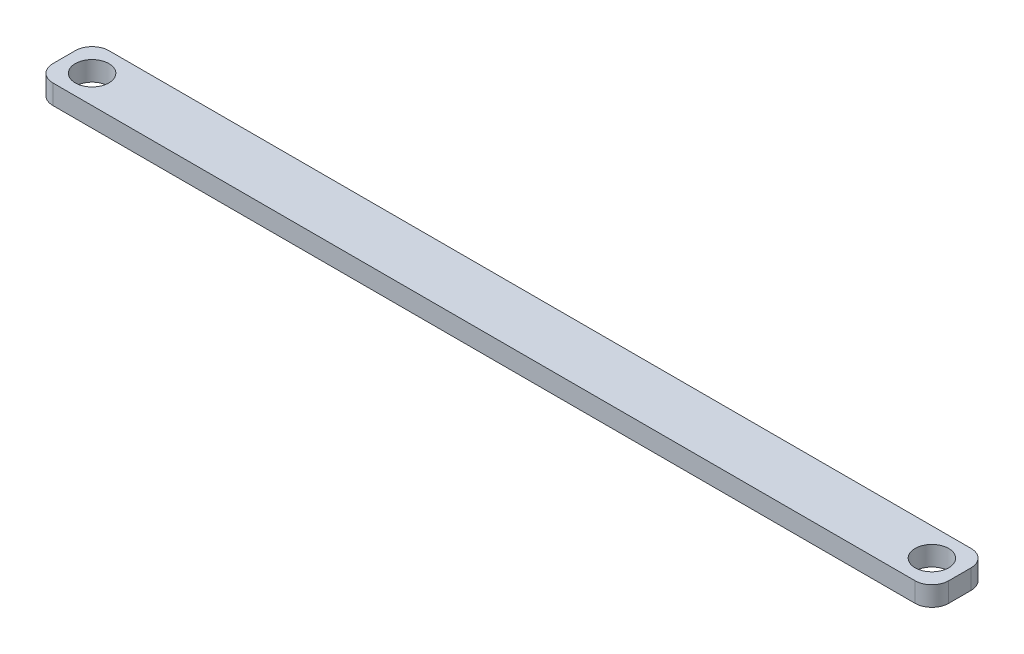
ISO-10303-21;
HEADER;
FILE_DESCRIPTION(('STEP AP214'),'2;1');
FILE_NAME('part.step','',(''),(''),'','','');
FILE_SCHEMA(('AUTOMOTIVE_DESIGN { 1 0 10303 214 1 1 1 1 }'));
ENDSEC;
DATA;
#1=APPLICATION_CONTEXT('core data for automotive mechanical design processes');
#2=APPLICATION_PROTOCOL_DEFINITION('international standard','automotive_design',2000,#1);
#3=PRODUCT_CONTEXT('',#1,'mechanical');
#4=PRODUCT('Part','Part','',(#3));
#5=PRODUCT_RELATED_PRODUCT_CATEGORY('part','',(#4));
#6=PRODUCT_DEFINITION_FORMATION('','',#4);
#7=PRODUCT_DEFINITION_CONTEXT('part definition',#1,'design');
#8=PRODUCT_DEFINITION('design','',#6,#7);
#9=PRODUCT_DEFINITION_SHAPE('','',#8);
#10=(LENGTH_UNIT() NAMED_UNIT(*) SI_UNIT(.MILLI.,.METRE.));
#11=(NAMED_UNIT(*) PLANE_ANGLE_UNIT() SI_UNIT($,.RADIAN.));
#12=(NAMED_UNIT(*) SI_UNIT($,.STERADIAN.) SOLID_ANGLE_UNIT());
#13=UNCERTAINTY_MEASURE_WITH_UNIT(LENGTH_MEASURE(1.E-05),#10,'distance_accuracy_value','');
#14=(GEOMETRIC_REPRESENTATION_CONTEXT(3) GLOBAL_UNCERTAINTY_ASSIGNED_CONTEXT((#13)) GLOBAL_UNIT_ASSIGNED_CONTEXT((#10,
#11,#12)) REPRESENTATION_CONTEXT('',''));
#15=CARTESIAN_POINT('',(0.,0.,0.));
#16=DIRECTION('',(0.,0.,1.));
#17=DIRECTION('',(1.,0.,0.));
#18=AXIS2_PLACEMENT_3D('',#15,#16,#17);
#19=CARTESIAN_POINT('',(157.,3.5,7.));
#20=DIRECTION('',(0.,1.,0.));
#21=DIRECTION('',(0.,0.,1.));
#22=AXIS2_PLACEMENT_3D('',#19,#20,#21);
#23=PLANE('',#22);
#24=CARTESIAN_POINT('',(5.,3.5,5.));
#25=DIRECTION('',(0.,1.,0.));
#26=DIRECTION('',(0.,0.,1.));
#27=AXIS2_PLACEMENT_3D('',#24,#25,#26);
#28=CIRCLE('',#27,3.);
#29=CARTESIAN_POINT('',(5.,3.5,8.));
#30=VERTEX_POINT('',#29);
#31=EDGE_CURVE('E146',#30,#30,#28,.T.);
#32=ORIENTED_EDGE('',*,*,#31,.F.);
#33=EDGE_LOOP('',(#32));
#34=FACE_BOUND('',#33,.T.);
#35=CARTESIAN_POINT('',(157.,3.5,7.));
#36=DIRECTION('',(0.,1.,0.));
#37=DIRECTION('',(0.,0.,1.));
#38=AXIS2_PLACEMENT_3D('',#35,#36,#37);
#39=CIRCLE('',#38,3.);
#40=CARTESIAN_POINT('',(157.,3.5,10.));
#41=VERTEX_POINT('',#40);
#42=CARTESIAN_POINT('',(160.,3.5,7.));
#43=VERTEX_POINT('',#42);
#44=EDGE_CURVE('E164',#41,#43,#39,.T.);
#45=ORIENTED_EDGE('',*,*,#44,.T.);
#46=DIRECTION('',(0.,0.,-1.));
#47=VECTOR('',#46,1.);
#48=CARTESIAN_POINT('',(160.,3.5,3.));
#49=LINE('',#48,#47);
#50=CARTESIAN_POINT('',(160.,3.5,3.));
#51=VERTEX_POINT('',#50);
#52=EDGE_CURVE('E100',#43,#51,#49,.T.);
#53=ORIENTED_EDGE('',*,*,#52,.T.);
#54=CARTESIAN_POINT('',(157.,3.5,3.));
#55=DIRECTION('',(0.,1.,0.));
#56=DIRECTION('',(0.,0.,-1.));
#57=AXIS2_PLACEMENT_3D('',#54,#55,#56);
#58=CIRCLE('',#57,3.);
#59=CARTESIAN_POINT('',(157.,3.5,0.));
#60=VERTEX_POINT('',#59);
#61=EDGE_CURVE('E185',#51,#60,#58,.T.);
#62=ORIENTED_EDGE('',*,*,#61,.T.);
#63=DIRECTION('',(-1.,0.,0.));
#64=VECTOR('',#63,1.);
#65=CARTESIAN_POINT('',(3.00000000000002,3.5,0.));
#66=LINE('',#65,#64);
#67=CARTESIAN_POINT('',(3.00000000000002,3.5,0.));
#68=VERTEX_POINT('',#67);
#69=EDGE_CURVE('E199',#60,#68,#66,.T.);
#70=ORIENTED_EDGE('',*,*,#69,.T.);
#71=CARTESIAN_POINT('',(3.,3.5,3.));
#72=DIRECTION('',(0.,1.,0.));
#73=DIRECTION('',(0.,0.,1.));
#74=AXIS2_PLACEMENT_3D('',#71,#72,#73);
#75=CIRCLE('',#74,3.);
#76=CARTESIAN_POINT('',(0.,3.5,3.00000000000002));
#77=VERTEX_POINT('',#76);
#78=EDGE_CURVE('E119',#68,#77,#75,.T.);
#79=ORIENTED_EDGE('',*,*,#78,.T.);
#80=DIRECTION('',(0.,0.,1.));
#81=VECTOR('',#80,1.);
#82=CARTESIAN_POINT('',(0.,3.5,3.00000000000002));
#83=LINE('',#82,#81);
#84=CARTESIAN_POINT('',(0.,3.5,6.99999999999998));
#85=VERTEX_POINT('',#84);
#86=EDGE_CURVE('E113',#77,#85,#83,.T.);
#87=ORIENTED_EDGE('',*,*,#86,.T.);
#88=CARTESIAN_POINT('',(3.,3.5,7.));
#89=DIRECTION('',(0.,1.,0.));
#90=DIRECTION('',(0.,0.,1.));
#91=AXIS2_PLACEMENT_3D('',#88,#89,#90);
#92=CIRCLE('',#91,3.);
#93=CARTESIAN_POINT('',(3.00000000000002,3.5,10.));
#94=VERTEX_POINT('',#93);
#95=EDGE_CURVE('E117',#85,#94,#92,.T.);
#96=ORIENTED_EDGE('',*,*,#95,.T.);
#97=DIRECTION('',(1.,0.,0.));
#98=VECTOR('',#97,1.);
#99=CARTESIAN_POINT('',(3.00000000000002,3.5,10.));
#100=LINE('',#99,#98);
#101=EDGE_CURVE('E57',#94,#41,#100,.T.);
#102=ORIENTED_EDGE('',*,*,#101,.T.);
#103=EDGE_LOOP('',(#45,#53,#62,#70,#79,#87,#96,#102));
#104=FACE_BOUND('',#103,.T.);
#105=CARTESIAN_POINT('',(155.,3.5,5.));
#106=DIRECTION('',(0.,1.,0.));
#107=DIRECTION('',(0.,0.,1.));
#108=AXIS2_PLACEMENT_3D('',#105,#106,#107);
#109=CIRCLE('',#108,2.99999999999999);
#110=CARTESIAN_POINT('',(155.,3.5,7.99999999999999));
#111=VERTEX_POINT('',#110);
#112=EDGE_CURVE('E213',#111,#111,#109,.T.);
#113=ORIENTED_EDGE('',*,*,#112,.F.);
#114=EDGE_LOOP('',(#113));
#115=FACE_BOUND('',#114,.T.);
#116=ADVANCED_FACE('F39',(#34,#104,#115),#23,.T.);
#117=CARTESIAN_POINT('',(157.,0.,7.));
#118=DIRECTION('',(0.,1.,0.));
#119=DIRECTION('',(0.,0.,1.));
#120=AXIS2_PLACEMENT_3D('',#117,#118,#119);
#121=PLANE('',#120);
#122=CARTESIAN_POINT('',(157.,0.,7.));
#123=DIRECTION('',(0.,1.,0.));
#124=DIRECTION('',(0.,0.,1.));
#125=AXIS2_PLACEMENT_3D('',#122,#123,#124);
#126=CIRCLE('',#125,3.);
#127=CARTESIAN_POINT('',(157.,0.,10.));
#128=VERTEX_POINT('',#127);
#129=CARTESIAN_POINT('',(160.,0.,7.));
#130=VERTEX_POINT('',#129);
#131=EDGE_CURVE('E141',#128,#130,#126,.T.);
#132=ORIENTED_EDGE('',*,*,#131,.F.);
#133=DIRECTION('',(1.,0.,0.));
#134=VECTOR('',#133,1.);
#135=CARTESIAN_POINT('',(3.00000000000002,0.,10.));
#136=LINE('',#135,#134);
#137=CARTESIAN_POINT('',(3.00000000000002,0.,10.));
#138=VERTEX_POINT('',#137);
#139=EDGE_CURVE('E92',#138,#128,#136,.T.);
#140=ORIENTED_EDGE('',*,*,#139,.F.);
#141=CARTESIAN_POINT('',(3.,0.,7.));
#142=DIRECTION('',(0.,1.,0.));
#143=DIRECTION('',(0.,0.,1.));
#144=AXIS2_PLACEMENT_3D('',#141,#142,#143);
#145=CIRCLE('',#144,3.);
#146=CARTESIAN_POINT('',(0.,0.,6.99999999999998));
#147=VERTEX_POINT('',#146);
#148=EDGE_CURVE('E86',#147,#138,#145,.T.);
#149=ORIENTED_EDGE('',*,*,#148,.F.);
#150=DIRECTION('',(0.,0.,1.));
#151=VECTOR('',#150,1.);
#152=CARTESIAN_POINT('',(0.,0.,3.00000000000002));
#153=LINE('',#152,#151);
#154=CARTESIAN_POINT('',(0.,0.,3.00000000000002));
#155=VERTEX_POINT('',#154);
#156=EDGE_CURVE('E128',#155,#147,#153,.T.);
#157=ORIENTED_EDGE('',*,*,#156,.F.);
#158=CARTESIAN_POINT('',(3.,0.,3.));
#159=DIRECTION('',(0.,1.,0.));
#160=DIRECTION('',(0.,0.,1.));
#161=AXIS2_PLACEMENT_3D('',#158,#159,#160);
#162=CIRCLE('',#161,3.);
#163=CARTESIAN_POINT('',(3.00000000000002,0.,0.));
#164=VERTEX_POINT('',#163);
#165=EDGE_CURVE('E155',#164,#155,#162,.T.);
#166=ORIENTED_EDGE('',*,*,#165,.F.);
#167=DIRECTION('',(-1.,0.,0.));
#168=VECTOR('',#167,1.);
#169=CARTESIAN_POINT('',(3.00000000000002,0.,0.));
#170=LINE('',#169,#168);
#171=CARTESIAN_POINT('',(157.,0.,0.));
#172=VERTEX_POINT('',#171);
#173=EDGE_CURVE('E152',#172,#164,#170,.T.);
#174=ORIENTED_EDGE('',*,*,#173,.F.);
#175=CARTESIAN_POINT('',(157.,0.,3.));
#176=DIRECTION('',(0.,1.,0.));
#177=DIRECTION('',(0.,0.,-1.));
#178=AXIS2_PLACEMENT_3D('',#175,#176,#177);
#179=CIRCLE('',#178,3.);
#180=CARTESIAN_POINT('',(160.,0.,3.));
#181=VERTEX_POINT('',#180);
#182=EDGE_CURVE('E149',#181,#172,#179,.T.);
#183=ORIENTED_EDGE('',*,*,#182,.F.);
#184=DIRECTION('',(0.,0.,-1.));
#185=VECTOR('',#184,1.);
#186=CARTESIAN_POINT('',(160.,0.,3.));
#187=LINE('',#186,#185);
#188=EDGE_CURVE('E145',#130,#181,#187,.T.);
#189=ORIENTED_EDGE('',*,*,#188,.F.);
#190=EDGE_LOOP('',(#132,#140,#149,#157,#166,#174,#183,#189));
#191=FACE_BOUND('',#190,.T.);
#192=CARTESIAN_POINT('',(5.,0.,5.));
#193=DIRECTION('',(0.,1.,0.));
#194=DIRECTION('',(0.,0.,1.));
#195=AXIS2_PLACEMENT_3D('',#192,#193,#194);
#196=CIRCLE('',#195,3.);
#197=CARTESIAN_POINT('',(5.,0.,8.));
#198=VERTEX_POINT('',#197);
#199=EDGE_CURVE('E209',#198,#198,#196,.T.);
#200=ORIENTED_EDGE('',*,*,#199,.T.);
#201=EDGE_LOOP('',(#200));
#202=FACE_BOUND('',#201,.T.);
#203=CARTESIAN_POINT('',(155.,0.,5.));
#204=DIRECTION('',(0.,1.,0.));
#205=DIRECTION('',(0.,0.,1.));
#206=AXIS2_PLACEMENT_3D('',#203,#204,#205);
#207=CIRCLE('',#206,2.99999999999999);
#208=CARTESIAN_POINT('',(155.,0.,7.99999999999999));
#209=VERTEX_POINT('',#208);
#210=EDGE_CURVE('E217',#209,#209,#207,.T.);
#211=ORIENTED_EDGE('',*,*,#210,.T.);
#212=EDGE_LOOP('',(#211));
#213=FACE_BOUND('',#212,.T.);
#214=ADVANCED_FACE('F189',(#191,#202,#213),#121,.F.);
#215=CARTESIAN_POINT('',(157.,3.5,7.));
#216=DIRECTION('',(0.,-1.,0.));
#217=DIRECTION('',(0.,0.,-1.));
#218=AXIS2_PLACEMENT_3D('',#215,#216,#217);
#219=CYLINDRICAL_SURFACE('',#218,3.);
#220=ORIENTED_EDGE('',*,*,#131,.T.);
#221=DIRECTION('',(0.,-1.,0.));
#222=VECTOR('',#221,1.);
#223=CARTESIAN_POINT('',(160.,3.5,7.));
#224=LINE('',#223,#222);
#225=EDGE_CURVE('E11',#43,#130,#224,.T.);
#226=ORIENTED_EDGE('',*,*,#225,.F.);
#227=ORIENTED_EDGE('',*,*,#44,.F.);
#228=DIRECTION('',(0.,-1.,0.));
#229=VECTOR('',#228,1.);
#230=CARTESIAN_POINT('',(157.,3.5,10.));
#231=LINE('',#230,#229);
#232=EDGE_CURVE('E137',#41,#128,#231,.T.);
#233=ORIENTED_EDGE('',*,*,#232,.T.);
#234=EDGE_LOOP('',(#220,#226,#227,#233));
#235=FACE_BOUND('',#234,.T.);
#236=ADVANCED_FACE('F41',(#235),#219,.T.);
#237=CARTESIAN_POINT('',(160.,3.5,3.));
#238=DIRECTION('',(-1.,0.,0.));
#239=DIRECTION('',(0.,0.,1.));
#240=AXIS2_PLACEMENT_3D('',#237,#238,#239);
#241=PLANE('',#240);
#242=ORIENTED_EDGE('',*,*,#188,.T.);
#243=DIRECTION('',(0.,-1.,0.));
#244=VECTOR('',#243,1.);
#245=CARTESIAN_POINT('',(160.,3.5,3.));
#246=LINE('',#245,#244);
#247=EDGE_CURVE('E49',#51,#181,#246,.T.);
#248=ORIENTED_EDGE('',*,*,#247,.F.);
#249=ORIENTED_EDGE('',*,*,#52,.F.);
#250=ORIENTED_EDGE('',*,*,#225,.T.);
#251=EDGE_LOOP('',(#242,#248,#249,#250));
#252=FACE_BOUND('',#251,.T.);
#253=ADVANCED_FACE('F251',(#252),#241,.F.);
#254=CARTESIAN_POINT('',(157.,3.5,3.));
#255=DIRECTION('',(0.,-1.,0.));
#256=DIRECTION('',(0.,0.,-1.));
#257=AXIS2_PLACEMENT_3D('',#254,#255,#256);
#258=CYLINDRICAL_SURFACE('',#257,3.);
#259=ORIENTED_EDGE('',*,*,#182,.T.);
#260=DIRECTION('',(0.,-1.,0.));
#261=VECTOR('',#260,1.);
#262=CARTESIAN_POINT('',(157.,3.5,0.));
#263=LINE('',#262,#261);
#264=EDGE_CURVE('E175',#60,#172,#263,.T.);
#265=ORIENTED_EDGE('',*,*,#264,.F.);
#266=ORIENTED_EDGE('',*,*,#61,.F.);
#267=ORIENTED_EDGE('',*,*,#247,.T.);
#268=EDGE_LOOP('',(#259,#265,#266,#267));
#269=FACE_BOUND('',#268,.T.);
#270=ADVANCED_FACE('F183',(#269),#258,.T.);
#271=CARTESIAN_POINT('',(3.00000000000002,3.5,0.));
#272=DIRECTION('',(0.,0.,1.));
#273=DIRECTION('',(1.,0.,0.));
#274=AXIS2_PLACEMENT_3D('',#271,#272,#273);
#275=PLANE('',#274);
#276=ORIENTED_EDGE('',*,*,#173,.T.);
#277=DIRECTION('',(0.,-1.,0.));
#278=VECTOR('',#277,1.);
#279=CARTESIAN_POINT('',(3.00000000000002,3.5,0.));
#280=LINE('',#279,#278);
#281=EDGE_CURVE('E171',#68,#164,#280,.T.);
#282=ORIENTED_EDGE('',*,*,#281,.F.);
#283=ORIENTED_EDGE('',*,*,#69,.F.);
#284=ORIENTED_EDGE('',*,*,#264,.T.);
#285=EDGE_LOOP('',(#276,#282,#283,#284));
#286=FACE_BOUND('',#285,.T.);
#287=ADVANCED_FACE('F194',(#286),#275,.F.);
#288=CARTESIAN_POINT('',(3.,3.5,3.));
#289=DIRECTION('',(0.,-1.,0.));
#290=DIRECTION('',(0.,0.,-1.));
#291=AXIS2_PLACEMENT_3D('',#288,#289,#290);
#292=CYLINDRICAL_SURFACE('',#291,3.);
#293=ORIENTED_EDGE('',*,*,#165,.T.);
#294=DIRECTION('',(0.,-1.,0.));
#295=VECTOR('',#294,1.);
#296=CARTESIAN_POINT('',(0.,3.5,3.00000000000002));
#297=LINE('',#296,#295);
#298=EDGE_CURVE('E130',#77,#155,#297,.T.);
#299=ORIENTED_EDGE('',*,*,#298,.F.);
#300=ORIENTED_EDGE('',*,*,#78,.F.);
#301=ORIENTED_EDGE('',*,*,#281,.T.);
#302=EDGE_LOOP('',(#293,#299,#300,#301));
#303=FACE_BOUND('',#302,.T.);
#304=ADVANCED_FACE('F197',(#303),#292,.T.);
#305=CARTESIAN_POINT('',(0.,3.5,3.00000000000002));
#306=DIRECTION('',(1.,0.,0.));
#307=DIRECTION('',(0.,0.,-1.));
#308=AXIS2_PLACEMENT_3D('',#305,#306,#307);
#309=PLANE('',#308);
#310=ORIENTED_EDGE('',*,*,#156,.T.);
#311=DIRECTION('',(0.,-1.,0.));
#312=VECTOR('',#311,1.);
#313=CARTESIAN_POINT('',(0.,3.5,6.99999999999998));
#314=LINE('',#313,#312);
#315=EDGE_CURVE('E125',#85,#147,#314,.T.);
#316=ORIENTED_EDGE('',*,*,#315,.F.);
#317=ORIENTED_EDGE('',*,*,#86,.F.);
#318=ORIENTED_EDGE('',*,*,#298,.T.);
#319=EDGE_LOOP('',(#310,#316,#317,#318));
#320=FACE_BOUND('',#319,.T.);
#321=ADVANCED_FACE('F126',(#320),#309,.F.);
#322=CARTESIAN_POINT('',(3.,3.5,7.));
#323=DIRECTION('',(0.,-1.,0.));
#324=DIRECTION('',(0.,0.,-1.));
#325=AXIS2_PLACEMENT_3D('',#322,#323,#324);
#326=CYLINDRICAL_SURFACE('',#325,3.);
#327=ORIENTED_EDGE('',*,*,#148,.T.);
#328=DIRECTION('',(0.,-1.,0.));
#329=VECTOR('',#328,1.);
#330=CARTESIAN_POINT('',(3.00000000000002,3.5,10.));
#331=LINE('',#330,#329);
#332=EDGE_CURVE('E131',#94,#138,#331,.T.);
#333=ORIENTED_EDGE('',*,*,#332,.F.);
#334=ORIENTED_EDGE('',*,*,#95,.F.);
#335=ORIENTED_EDGE('',*,*,#315,.T.);
#336=EDGE_LOOP('',(#327,#333,#334,#335));
#337=FACE_BOUND('',#336,.T.);
#338=ADVANCED_FACE('F133',(#337),#326,.T.);
#339=CARTESIAN_POINT('',(3.00000000000002,3.5,10.));
#340=DIRECTION('',(0.,0.,-1.));
#341=DIRECTION('',(-1.,0.,0.));
#342=AXIS2_PLACEMENT_3D('',#339,#340,#341);
#343=PLANE('',#342);
#344=ORIENTED_EDGE('',*,*,#139,.T.);
#345=ORIENTED_EDGE('',*,*,#232,.F.);
#346=ORIENTED_EDGE('',*,*,#101,.F.);
#347=ORIENTED_EDGE('',*,*,#332,.T.);
#348=EDGE_LOOP('',(#344,#345,#346,#347));
#349=FACE_BOUND('',#348,.T.);
#350=ADVANCED_FACE('F239',(#349),#343,.F.);
#351=CARTESIAN_POINT('',(5.,3.5,5.));
#352=DIRECTION('',(0.,-1.,0.));
#353=DIRECTION('',(0.,0.,-1.));
#354=AXIS2_PLACEMENT_3D('',#351,#352,#353);
#355=CYLINDRICAL_SURFACE('',#354,3.);
#356=ORIENTED_EDGE('',*,*,#31,.T.);
#357=EDGE_LOOP('',(#356));
#358=FACE_BOUND('',#357,.T.);
#359=ORIENTED_EDGE('',*,*,#199,.F.);
#360=EDGE_LOOP('',(#359));
#361=FACE_BOUND('',#360,.T.);
#362=ADVANCED_FACE('F236',(#358,#361),#355,.F.);
#363=CARTESIAN_POINT('',(155.,3.5,5.));
#364=DIRECTION('',(0.,-1.,0.));
#365=DIRECTION('',(0.,0.,-1.));
#366=AXIS2_PLACEMENT_3D('',#363,#364,#365);
#367=CYLINDRICAL_SURFACE('',#366,2.99999999999999);
#368=ORIENTED_EDGE('',*,*,#112,.T.);
#369=EDGE_LOOP('',(#368));
#370=FACE_BOUND('',#369,.T.);
#371=ORIENTED_EDGE('',*,*,#210,.F.);
#372=EDGE_LOOP('',(#371));
#373=FACE_BOUND('',#372,.T.);
#374=ADVANCED_FACE('F225',(#370,#373),#367,.F.);
#375=CLOSED_SHELL('',(#116,#214,#236,#253,#270,#287,#304,#321,#338,#350,#362,#374));
#376=MANIFOLD_SOLID_BREP('B2',#375);
#377=ADVANCED_BREP_SHAPE_REPRESENTATION('',(#18,#376),#14);
#378=SHAPE_DEFINITION_REPRESENTATION(#9,#377);
ENDSEC;
END-ISO-10303-21;
